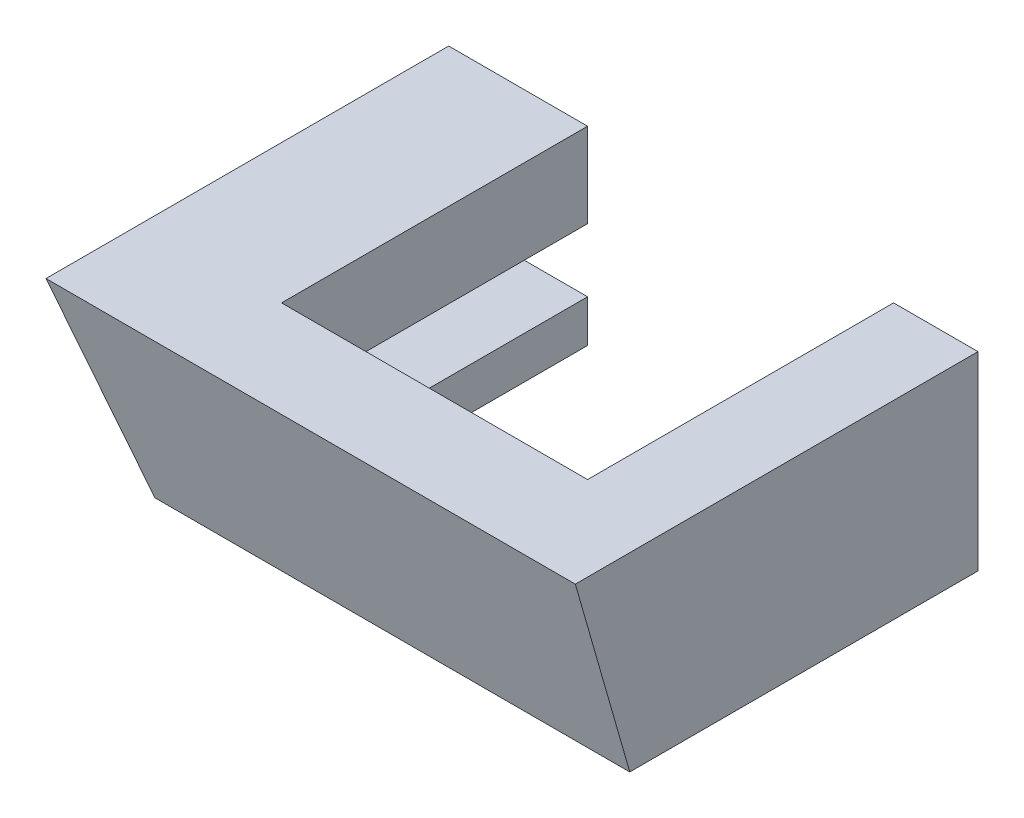
ISO-10303-21;
HEADER;
FILE_DESCRIPTION(('STEP AP214'),'2;1');
FILE_NAME('part.step','',(''),(''),'','','');
FILE_SCHEMA(('AUTOMOTIVE_DESIGN { 1 0 10303 214 1 1 1 1 }'));
ENDSEC;
DATA;
#1=APPLICATION_CONTEXT('core data for automotive mechanical design processes');
#2=APPLICATION_PROTOCOL_DEFINITION('international standard','automotive_design',2000,#1);
#3=PRODUCT_CONTEXT('',#1,'mechanical');
#4=PRODUCT('Part','Part','',(#3));
#5=PRODUCT_RELATED_PRODUCT_CATEGORY('part','',(#4));
#6=PRODUCT_DEFINITION_FORMATION('','',#4);
#7=PRODUCT_DEFINITION_CONTEXT('part definition',#1,'design');
#8=PRODUCT_DEFINITION('design','',#6,#7);
#9=PRODUCT_DEFINITION_SHAPE('','',#8);
#10=(LENGTH_UNIT() NAMED_UNIT(*) SI_UNIT(.MILLI.,.METRE.));
#11=(NAMED_UNIT(*) PLANE_ANGLE_UNIT() SI_UNIT($,.RADIAN.));
#12=(NAMED_UNIT(*) SI_UNIT($,.STERADIAN.) SOLID_ANGLE_UNIT());
#13=UNCERTAINTY_MEASURE_WITH_UNIT(LENGTH_MEASURE(1.E-05),#10,'distance_accuracy_value','');
#14=(GEOMETRIC_REPRESENTATION_CONTEXT(3) GLOBAL_UNCERTAINTY_ASSIGNED_CONTEXT((#13)) GLOBAL_UNIT_ASSIGNED_CONTEXT((#10,
#11,#12)) REPRESENTATION_CONTEXT('',''));
#15=CARTESIAN_POINT('',(0.,0.,0.));
#16=DIRECTION('',(0.,0.,1.));
#17=DIRECTION('',(1.,0.,0.));
#18=AXIS2_PLACEMENT_3D('',#15,#16,#17);
#19=CARTESIAN_POINT('',(-22.5892857142857,9.,40.6249999999999));
#20=DIRECTION('',(0.,0.,1.));
#21=DIRECTION('',(1.,0.,0.));
#22=AXIS2_PLACEMENT_3D('',#19,#20,#21);
#23=PLANE('',#22);
#24=DIRECTION('',(1.,0.,0.));
#25=VECTOR('',#24,1.);
#26=CARTESIAN_POINT('',(-23.5892857142856,2.,40.6249999999999));
#27=LINE('',#26,#25);
#28=CARTESIAN_POINT('',(-26.5892857142856,2.,40.6249999999999));
#29=VERTEX_POINT('',#28);
#30=CARTESIAN_POINT('',(-23.5892857142856,2.,40.6249999999999));
#31=VERTEX_POINT('',#30);
#32=EDGE_CURVE('E196',#29,#31,#27,.T.);
#33=ORIENTED_EDGE('',*,*,#32,.T.);
#34=DIRECTION('',(0.,1.,0.));
#35=VECTOR('',#34,1.);
#36=CARTESIAN_POINT('',(-23.5892857142856,2.,40.6249999999999));
#37=LINE('',#36,#35);
#38=CARTESIAN_POINT('',(-23.5892857142856,5.,40.6249999999999));
#39=VERTEX_POINT('',#38);
#40=EDGE_CURVE('E173',#31,#39,#37,.T.);
#41=ORIENTED_EDGE('',*,*,#40,.T.);
#42=DIRECTION('',(-1.,0.,0.));
#43=VECTOR('',#42,1.);
#44=CARTESIAN_POINT('',(-23.5892857142856,5.,40.6249999999999));
#45=LINE('',#44,#43);
#46=CARTESIAN_POINT('',(-26.5892857142856,5.,40.6249999999999));
#47=VERTEX_POINT('',#46);
#48=EDGE_CURVE('E167',#39,#47,#45,.T.);
#49=ORIENTED_EDGE('',*,*,#48,.T.);
#50=DIRECTION('',(0.,-1.,0.));
#51=VECTOR('',#50,1.);
#52=CARTESIAN_POINT('',(-26.5892857142857,9.,40.6249999999999));
#53=LINE('',#52,#51);
#54=CARTESIAN_POINT('',(-26.5892857142857,9.,40.6249999999999));
#55=VERTEX_POINT('',#54);
#56=EDGE_CURVE('E264',#55,#47,#53,.T.);
#57=ORIENTED_EDGE('',*,*,#56,.F.);
#58=DIRECTION('',(-1.,0.,0.));
#59=VECTOR('',#58,1.);
#60=CARTESIAN_POINT('',(-22.5892857142857,9.,40.6249999999999));
#61=LINE('',#60,#59);
#62=CARTESIAN_POINT('',(-22.5892857142857,9.,40.6249999999999));
#63=VERTEX_POINT('',#62);
#64=EDGE_CURVE('E283',#63,#55,#61,.T.);
#65=ORIENTED_EDGE('',*,*,#64,.F.);
#66=DIRECTION('',(0.,-1.,0.));
#67=VECTOR('',#66,1.);
#68=CARTESIAN_POINT('',(-22.5892857142857,9.,40.6249999999999));
#69=LINE('',#68,#67);
#70=CARTESIAN_POINT('',(-22.5892857142857,0.,40.6249999999999));
#71=VERTEX_POINT('',#70);
#72=EDGE_CURVE('E303',#63,#71,#69,.T.);
#73=ORIENTED_EDGE('',*,*,#72,.T.);
#74=DIRECTION('',(-1.,0.,0.));
#75=VECTOR('',#74,1.);
#76=CARTESIAN_POINT('',(-22.5892857142857,0.,40.6249999999999));
#77=LINE('',#76,#75);
#78=CARTESIAN_POINT('',(-26.5892857142857,0.,40.6249999999999));
#79=VERTEX_POINT('',#78);
#80=EDGE_CURVE('E298',#71,#79,#77,.T.);
#81=ORIENTED_EDGE('',*,*,#80,.T.);
#82=EDGE_CURVE('E268',#29,#79,#53,.T.);
#83=ORIENTED_EDGE('',*,*,#82,.F.);
#84=EDGE_LOOP('',(#33,#41,#49,#57,#65,#73,#81,#83));
#85=FACE_BOUND('',#84,.T.);
#86=ADVANCED_FACE('F45',(#85),#23,.F.);
#87=DIRECTION('',(1.,0.,0.));
#88=VECTOR('',#87,1.);
#89=CARTESIAN_POINT('',(-44.0892857142857,2.,40.6249999999999));
#90=LINE('',#89,#88);
#91=CARTESIAN_POINT('',(-44.0892857142857,2.,40.6249999999999));
#92=VERTEX_POINT('',#91);
#93=CARTESIAN_POINT('',(-41.0892857142856,2.,40.6249999999999));
#94=VERTEX_POINT('',#93);
#95=EDGE_CURVE('E218',#92,#94,#90,.T.);
#96=ORIENTED_EDGE('',*,*,#95,.T.);
#97=DIRECTION('',(0.,-1.,0.));
#98=VECTOR('',#97,1.);
#99=CARTESIAN_POINT('',(-41.0892857142857,9.,40.6249999999999));
#100=LINE('',#99,#98);
#101=CARTESIAN_POINT('',(-41.0892857142857,0.,40.6249999999999));
#102=VERTEX_POINT('',#101);
#103=EDGE_CURVE('E273',#94,#102,#100,.T.);
#104=ORIENTED_EDGE('',*,*,#103,.T.);
#105=CARTESIAN_POINT('',(-45.0892857142857,0.,40.6249999999999));
#106=VERTEX_POINT('',#105);
#107=EDGE_CURVE('E297',#102,#106,#77,.T.);
#108=ORIENTED_EDGE('',*,*,#107,.T.);
#109=DIRECTION('',(-0.275637355816999,0.961261695938319,0.));
#110=VECTOR('',#109,1.);
#111=CARTESIAN_POINT('',(-45.0892857142857,0.,40.6249999999999));
#112=LINE('',#111,#110);
#113=CARTESIAN_POINT('',(-47.6699941861149,9.,40.6249999999999));
#114=VERTEX_POINT('',#113);
#115=EDGE_CURVE('E287',#114,#106,#112,.F.);
#116=ORIENTED_EDGE('',*,*,#115,.F.);
#117=CARTESIAN_POINT('',(-41.0892857142857,9.,40.6249999999999));
#118=VERTEX_POINT('',#117);
#119=EDGE_CURVE('E281',#118,#114,#61,.T.);
#120=ORIENTED_EDGE('',*,*,#119,.F.);
#121=CARTESIAN_POINT('',(-41.0892857142856,5.,40.6249999999999));
#122=VERTEX_POINT('',#121);
#123=EDGE_CURVE('E269',#118,#122,#100,.T.);
#124=ORIENTED_EDGE('',*,*,#123,.T.);
#125=DIRECTION('',(-1.,0.,0.));
#126=VECTOR('',#125,1.);
#127=CARTESIAN_POINT('',(-44.0892857142857,5.,40.6249999999999));
#128=LINE('',#127,#126);
#129=CARTESIAN_POINT('',(-44.0892857142857,5.,40.6249999999999));
#130=VERTEX_POINT('',#129);
#131=EDGE_CURVE('E215',#122,#130,#128,.T.);
#132=ORIENTED_EDGE('',*,*,#131,.T.);
#133=DIRECTION('',(0.,-1.,0.));
#134=VECTOR('',#133,1.);
#135=CARTESIAN_POINT('',(-44.0892857142857,2.,40.6249999999999));
#136=LINE('',#135,#134);
#137=EDGE_CURVE('E209',#130,#92,#136,.T.);
#138=ORIENTED_EDGE('',*,*,#137,.T.);
#139=EDGE_LOOP('',(#96,#104,#108,#116,#120,#124,#132,#138));
#140=FACE_BOUND('',#139,.T.);
#141=ADVANCED_FACE('F339',(#140),#23,.F.);
#142=CARTESIAN_POINT('',(-26.5892857142857,9.,40.6249999999999));
#143=DIRECTION('',(1.,0.,0.));
#144=DIRECTION('',(0.,0.,-1.));
#145=AXIS2_PLACEMENT_3D('',#142,#143,#144);
#146=PLANE('',#145);
#147=DIRECTION('',(0.,0.,-1.));
#148=VECTOR('',#147,1.);
#149=CARTESIAN_POINT('',(-26.5892857142857,2.,59.3676406871192));
#150=LINE('',#149,#148);
#151=CARTESIAN_POINT('',(-26.5892857142857,2.,55.1249999999999));
#152=VERTEX_POINT('',#151);
#153=EDGE_CURVE('E62',#152,#29,#150,.T.);
#154=ORIENTED_EDGE('',*,*,#153,.T.);
#155=ORIENTED_EDGE('',*,*,#82,.T.);
#156=DIRECTION('',(0.,0.,1.));
#157=VECTOR('',#156,1.);
#158=CARTESIAN_POINT('',(-26.5892857142857,0.,40.6249999999999));
#159=LINE('',#158,#157);
#160=CARTESIAN_POINT('',(-26.5892857142857,0.,55.1249999999999));
#161=VERTEX_POINT('',#160);
#162=EDGE_CURVE('E245',#79,#161,#159,.T.);
#163=ORIENTED_EDGE('',*,*,#162,.T.);
#164=DIRECTION('',(0.,-1.,0.));
#165=VECTOR('',#164,1.);
#166=CARTESIAN_POINT('',(-26.5892857142857,9.,55.1249999999999));
#167=LINE('',#166,#165);
#168=EDGE_CURVE('E263',#152,#161,#167,.T.);
#169=ORIENTED_EDGE('',*,*,#168,.F.);
#170=EDGE_LOOP('',(#154,#155,#163,#169));
#171=FACE_BOUND('',#170,.T.);
#172=ADVANCED_FACE('F362',(#171),#146,.F.);
#173=DIRECTION('',(0.,0.,-1.));
#174=VECTOR('',#173,1.);
#175=CARTESIAN_POINT('',(-26.5892857142857,5.,59.3676406871192));
#176=LINE('',#175,#174);
#177=CARTESIAN_POINT('',(-26.5892857142857,5.,55.1249999999999));
#178=VERTEX_POINT('',#177);
#179=EDGE_CURVE('E201',#178,#47,#176,.T.);
#180=ORIENTED_EDGE('',*,*,#179,.F.);
#181=CARTESIAN_POINT('',(-26.5892857142857,9.,55.1249999999999));
#182=VERTEX_POINT('',#181);
#183=EDGE_CURVE('E181',#182,#178,#167,.T.);
#184=ORIENTED_EDGE('',*,*,#183,.F.);
#185=DIRECTION('',(0.,0.,1.));
#186=VECTOR('',#185,1.);
#187=CARTESIAN_POINT('',(-26.5892857142857,9.,40.6249999999999));
#188=LINE('',#187,#186);
#189=EDGE_CURVE('E249',#55,#182,#188,.T.);
#190=ORIENTED_EDGE('',*,*,#189,.F.);
#191=ORIENTED_EDGE('',*,*,#56,.T.);
#192=EDGE_LOOP('',(#180,#184,#190,#191));
#193=FACE_BOUND('',#192,.T.);
#194=ADVANCED_FACE('F332',(#193),#146,.F.);
#195=CARTESIAN_POINT('',(-41.0892857142857,9.,55.1249999999999));
#196=DIRECTION('',(-1.,0.,0.));
#197=DIRECTION('',(0.,0.,1.));
#198=AXIS2_PLACEMENT_3D('',#195,#196,#197);
#199=PLANE('',#198);
#200=DIRECTION('',(0.,0.,-1.));
#201=VECTOR('',#200,1.);
#202=CARTESIAN_POINT('',(-41.0892857142857,2.,59.3676406871192));
#203=LINE('',#202,#201);
#204=CARTESIAN_POINT('',(-41.0892857142857,2.,55.1249999999999));
#205=VERTEX_POINT('',#204);
#206=EDGE_CURVE('E214',#205,#94,#203,.T.);
#207=ORIENTED_EDGE('',*,*,#206,.F.);
#208=DIRECTION('',(0.,-1.,0.));
#209=VECTOR('',#208,1.);
#210=CARTESIAN_POINT('',(-41.0892857142857,9.,55.1249999999999));
#211=LINE('',#210,#209);
#212=CARTESIAN_POINT('',(-41.0892857142857,0.,55.1249999999999));
#213=VERTEX_POINT('',#212);
#214=EDGE_CURVE('E252',#205,#213,#211,.T.);
#215=ORIENTED_EDGE('',*,*,#214,.T.);
#216=DIRECTION('',(0.,0.,-1.));
#217=VECTOR('',#216,1.);
#218=CARTESIAN_POINT('',(-41.0892857142857,0.,55.1249999999999));
#219=LINE('',#218,#217);
#220=EDGE_CURVE('E192',#213,#102,#219,.T.);
#221=ORIENTED_EDGE('',*,*,#220,.T.);
#222=ORIENTED_EDGE('',*,*,#103,.F.);
#223=EDGE_LOOP('',(#207,#215,#221,#222));
#224=FACE_BOUND('',#223,.T.);
#225=ADVANCED_FACE('F359',(#224),#199,.F.);
#226=DIRECTION('',(0.,0.,-1.));
#227=VECTOR('',#226,1.);
#228=CARTESIAN_POINT('',(-41.0892857142857,5.,59.3676406871192));
#229=LINE('',#228,#227);
#230=CARTESIAN_POINT('',(-41.0892857142857,5.,55.1249999999999));
#231=VERTEX_POINT('',#230);
#232=EDGE_CURVE('E210',#231,#122,#229,.T.);
#233=ORIENTED_EDGE('',*,*,#232,.T.);
#234=ORIENTED_EDGE('',*,*,#123,.F.);
#235=DIRECTION('',(0.,0.,-1.));
#236=VECTOR('',#235,1.);
#237=CARTESIAN_POINT('',(-41.0892857142857,9.,55.1249999999999));
#238=LINE('',#237,#236);
#239=CARTESIAN_POINT('',(-41.0892857142857,9.,55.1249999999999));
#240=VERTEX_POINT('',#239);
#241=EDGE_CURVE('E244',#240,#118,#238,.T.);
#242=ORIENTED_EDGE('',*,*,#241,.F.);
#243=EDGE_CURVE('E274',#240,#231,#211,.T.);
#244=ORIENTED_EDGE('',*,*,#243,.T.);
#245=EDGE_LOOP('',(#233,#234,#242,#244));
#246=FACE_BOUND('',#245,.T.);
#247=ADVANCED_FACE('F335',(#246),#199,.F.);
#248=CARTESIAN_POINT('',(-45.0892857142857,0.,40.6249999999999));
#249=DIRECTION('',(-0.961261695938319,-0.275637355816999,0.));
#250=DIRECTION('',(0.275637355816999,-0.961261695938319,0.));
#251=AXIS2_PLACEMENT_3D('',#248,#249,#250);
#252=PLANE('',#251);
#253=DIRECTION('',(0.,0.,1.));
#254=VECTOR('',#253,1.);
#255=CARTESIAN_POINT('',(-45.0892857142857,0.,40.6249999999999));
#256=LINE('',#255,#254);
#257=CARTESIAN_POINT('',(-45.0892857142857,0.,57.1249999999999));
#258=VERTEX_POINT('',#257);
#259=EDGE_CURVE('E262',#106,#258,#256,.T.);
#260=ORIENTED_EDGE('',*,*,#259,.T.);
#261=DIRECTION('',(0.265727678029987,-0.926702542490083,-0.265727678029987));
#262=VECTOR('',#261,1.);
#263=CARTESIAN_POINT('',(-45.0892857142857,0.,57.1249999999999));
#264=LINE('',#263,#262);
#265=CARTESIAN_POINT('',(-47.6699941861149,9.,59.7057084718292));
#266=VERTEX_POINT('',#265);
#267=EDGE_CURVE('E11',#266,#258,#264,.T.);
#268=ORIENTED_EDGE('',*,*,#267,.F.);
#269=DIRECTION('',(0.,0.,-1.));
#270=VECTOR('',#269,1.);
#271=CARTESIAN_POINT('',(-47.6699941861149,9.,40.6249999999999));
#272=LINE('',#271,#270);
#273=EDGE_CURVE('E302',#114,#266,#272,.F.);
#274=ORIENTED_EDGE('',*,*,#273,.F.);
#275=ORIENTED_EDGE('',*,*,#115,.T.);
#276=EDGE_LOOP('',(#260,#268,#274,#275));
#277=FACE_BOUND('',#276,.T.);
#278=ADVANCED_FACE('F344',(#277),#252,.T.);
#279=CARTESIAN_POINT('',(-45.0892857142857,0.,57.1249999999999));
#280=DIRECTION('',(0.,-0.275637355816999,0.961261695938319));
#281=DIRECTION('',(0.,-0.961261695938319,-0.275637355816999));
#282=AXIS2_PLACEMENT_3D('',#279,#280,#281);
#283=PLANE('',#282);
#284=DIRECTION('',(1.,0.,0.));
#285=VECTOR('',#284,1.);
#286=CARTESIAN_POINT('',(-45.0892857142857,0.,57.1249999999999));
#287=LINE('',#286,#285);
#288=CARTESIAN_POINT('',(-22.5892857142857,0.,57.1249999999999));
#289=VERTEX_POINT('',#288);
#290=EDGE_CURVE('E291',#258,#289,#287,.T.);
#291=ORIENTED_EDGE('',*,*,#290,.T.);
#292=DIRECTION('',(0.,0.961261695938319,0.275637355816999));
#293=VECTOR('',#292,1.);
#294=CARTESIAN_POINT('',(-22.5892857142857,8.31621643270392,59.5096366890494));
#295=LINE('',#294,#293);
#296=CARTESIAN_POINT('',(-22.5892857142857,9.,59.7057084718292));
#297=VERTEX_POINT('',#296);
#298=EDGE_CURVE('E49',#297,#289,#295,.F.);
#299=ORIENTED_EDGE('',*,*,#298,.F.);
#300=DIRECTION('',(-1.,0.,0.));
#301=VECTOR('',#300,1.);
#302=CARTESIAN_POINT('',(-45.0892857142857,9.,59.7057084718292));
#303=LINE('',#302,#301);
#304=EDGE_CURVE('E282',#266,#297,#303,.F.);
#305=ORIENTED_EDGE('',*,*,#304,.F.);
#306=ORIENTED_EDGE('',*,*,#267,.T.);
#307=EDGE_LOOP('',(#291,#299,#305,#306));
#308=FACE_BOUND('',#307,.T.);
#309=ADVANCED_FACE('F47',(#308),#283,.T.);
#310=CARTESIAN_POINT('',(-22.5892857142857,9.,57.1249999999999));
#311=DIRECTION('',(-1.,0.,0.));
#312=DIRECTION('',(0.,0.,1.));
#313=AXIS2_PLACEMENT_3D('',#310,#311,#312);
#314=PLANE('',#313);
#315=DIRECTION('',(0.,0.,-1.));
#316=VECTOR('',#315,1.);
#317=CARTESIAN_POINT('',(-22.5892857142857,0.,57.1249999999999));
#318=LINE('',#317,#316);
#319=EDGE_CURVE('E294',#289,#71,#318,.T.);
#320=ORIENTED_EDGE('',*,*,#319,.T.);
#321=ORIENTED_EDGE('',*,*,#72,.F.);
#322=DIRECTION('',(0.,0.,-1.));
#323=VECTOR('',#322,1.);
#324=CARTESIAN_POINT('',(-22.5892857142857,9.,57.1249999999999));
#325=LINE('',#324,#323);
#326=EDGE_CURVE('E278',#297,#63,#325,.T.);
#327=ORIENTED_EDGE('',*,*,#326,.F.);
#328=ORIENTED_EDGE('',*,*,#298,.T.);
#329=EDGE_LOOP('',(#320,#321,#327,#328));
#330=FACE_BOUND('',#329,.T.);
#331=ADVANCED_FACE('F325',(#330),#314,.F.);
#332=CARTESIAN_POINT('',(0.,9.,0.));
#333=DIRECTION('',(0.,1.,0.));
#334=DIRECTION('',(0.,0.,1.));
#335=AXIS2_PLACEMENT_3D('',#332,#333,#334);
#336=PLANE('',#335);
#337=ORIENTED_EDGE('',*,*,#189,.T.);
#338=DIRECTION('',(-1.,0.,0.));
#339=VECTOR('',#338,1.);
#340=CARTESIAN_POINT('',(-26.5892857142857,9.,55.1249999999999));
#341=LINE('',#340,#339);
#342=EDGE_CURVE('E240',#182,#240,#341,.T.);
#343=ORIENTED_EDGE('',*,*,#342,.T.);
#344=ORIENTED_EDGE('',*,*,#241,.T.);
#345=ORIENTED_EDGE('',*,*,#119,.T.);
#346=ORIENTED_EDGE('',*,*,#273,.T.);
#347=ORIENTED_EDGE('',*,*,#304,.T.);
#348=ORIENTED_EDGE('',*,*,#326,.T.);
#349=ORIENTED_EDGE('',*,*,#64,.T.);
#350=EDGE_LOOP('',(#337,#343,#344,#345,#346,#347,#348,#349));
#351=FACE_BOUND('',#350,.T.);
#352=ADVANCED_FACE('F315',(#351),#336,.T.);
#353=CARTESIAN_POINT('',(0.,0.,0.));
#354=DIRECTION('',(0.,1.,0.));
#355=DIRECTION('',(0.,0.,1.));
#356=AXIS2_PLACEMENT_3D('',#353,#354,#355);
#357=PLANE('',#356);
#358=DIRECTION('',(-1.,0.,0.));
#359=VECTOR('',#358,1.);
#360=CARTESIAN_POINT('',(-26.5892857142857,0.,55.1249999999999));
#361=LINE('',#360,#359);
#362=EDGE_CURVE('E188',#161,#213,#361,.T.);
#363=ORIENTED_EDGE('',*,*,#362,.F.);
#364=ORIENTED_EDGE('',*,*,#162,.F.);
#365=ORIENTED_EDGE('',*,*,#80,.F.);
#366=ORIENTED_EDGE('',*,*,#319,.F.);
#367=ORIENTED_EDGE('',*,*,#290,.F.);
#368=ORIENTED_EDGE('',*,*,#259,.F.);
#369=ORIENTED_EDGE('',*,*,#107,.F.);
#370=ORIENTED_EDGE('',*,*,#220,.F.);
#371=EDGE_LOOP('',(#363,#364,#365,#366,#367,#368,#369,#370));
#372=FACE_BOUND('',#371,.T.);
#373=ADVANCED_FACE('F347',(#372),#357,.F.);
#374=CARTESIAN_POINT('',(-26.5892857142857,9.,55.1249999999999));
#375=DIRECTION('',(0.,0.,1.));
#376=DIRECTION('',(1.,0.,0.));
#377=AXIS2_PLACEMENT_3D('',#374,#375,#376);
#378=PLANE('',#377);
#379=ORIENTED_EDGE('',*,*,#362,.T.);
#380=ORIENTED_EDGE('',*,*,#214,.F.);
#381=DIRECTION('',(1.,0.,0.));
#382=VECTOR('',#381,1.);
#383=CARTESIAN_POINT('',(-44.0892857142857,2.,55.1249999999999));
#384=LINE('',#383,#382);
#385=CARTESIAN_POINT('',(-44.0892857142857,2.,55.1249999999999));
#386=VERTEX_POINT('',#385);
#387=EDGE_CURVE('E228',#386,#205,#384,.T.);
#388=ORIENTED_EDGE('',*,*,#387,.F.);
#389=DIRECTION('',(0.,-1.,0.));
#390=VECTOR('',#389,1.);
#391=CARTESIAN_POINT('',(-44.0892857142857,2.,55.1249999999999));
#392=LINE('',#391,#390);
#393=CARTESIAN_POINT('',(-44.0892857142857,5.,55.1249999999999));
#394=VERTEX_POINT('',#393);
#395=EDGE_CURVE('E224',#394,#386,#392,.T.);
#396=ORIENTED_EDGE('',*,*,#395,.F.);
#397=DIRECTION('',(-1.,0.,0.));
#398=VECTOR('',#397,1.);
#399=CARTESIAN_POINT('',(-44.0892857142857,5.,55.1249999999999));
#400=LINE('',#399,#398);
#401=EDGE_CURVE('E70',#231,#394,#400,.T.);
#402=ORIENTED_EDGE('',*,*,#401,.F.);
#403=ORIENTED_EDGE('',*,*,#243,.F.);
#404=ORIENTED_EDGE('',*,*,#342,.F.);
#405=ORIENTED_EDGE('',*,*,#183,.T.);
#406=DIRECTION('',(-1.,0.,0.));
#407=VECTOR('',#406,1.);
#408=CARTESIAN_POINT('',(-23.5892857142857,5.,55.1249999999999));
#409=LINE('',#408,#407);
#410=CARTESIAN_POINT('',(-23.5892857142857,5.,55.1249999999999));
#411=VERTEX_POINT('',#410);
#412=EDGE_CURVE('E164',#411,#178,#409,.T.);
#413=ORIENTED_EDGE('',*,*,#412,.F.);
#414=DIRECTION('',(0.,1.,0.));
#415=VECTOR('',#414,1.);
#416=CARTESIAN_POINT('',(-23.5892857142857,2.,55.1249999999999));
#417=LINE('',#416,#415);
#418=CARTESIAN_POINT('',(-23.5892857142857,2.,55.1249999999999));
#419=VERTEX_POINT('',#418);
#420=EDGE_CURVE('E178',#419,#411,#417,.T.);
#421=ORIENTED_EDGE('',*,*,#420,.F.);
#422=DIRECTION('',(1.,0.,0.));
#423=VECTOR('',#422,1.);
#424=CARTESIAN_POINT('',(-23.5892857142857,2.,55.1249999999999));
#425=LINE('',#424,#423);
#426=EDGE_CURVE('E183',#152,#419,#425,.T.);
#427=ORIENTED_EDGE('',*,*,#426,.F.);
#428=ORIENTED_EDGE('',*,*,#168,.T.);
#429=EDGE_LOOP('',(#379,#380,#388,#396,#402,#403,#404,#405,#413,#421,#427,#428));
#430=FACE_BOUND('',#429,.T.);
#431=ADVANCED_FACE('F177',(#430),#378,.F.);
#432=CARTESIAN_POINT('',(-44.0892857142857,2.,59.3676406871192));
#433=DIRECTION('',(1.,0.,0.));
#434=DIRECTION('',(0.,0.,-1.));
#435=AXIS2_PLACEMENT_3D('',#432,#433,#434);
#436=PLANE('',#435);
#437=ORIENTED_EDGE('',*,*,#395,.T.);
#438=DIRECTION('',(0.,0.,-1.));
#439=VECTOR('',#438,1.);
#440=CARTESIAN_POINT('',(-44.0892857142857,2.,59.3676406871192));
#441=LINE('',#440,#439);
#442=EDGE_CURVE('E219',#386,#92,#441,.T.);
#443=ORIENTED_EDGE('',*,*,#442,.T.);
#444=ORIENTED_EDGE('',*,*,#137,.F.);
#445=DIRECTION('',(0.,0.,-1.));
#446=VECTOR('',#445,1.);
#447=CARTESIAN_POINT('',(-44.0892857142857,5.,59.3676406871192));
#448=LINE('',#447,#446);
#449=EDGE_CURVE('E206',#394,#130,#448,.T.);
#450=ORIENTED_EDGE('',*,*,#449,.F.);
#451=EDGE_LOOP('',(#437,#443,#444,#450));
#452=FACE_BOUND('',#451,.T.);
#453=ADVANCED_FACE('F389',(#452),#436,.T.);
#454=CARTESIAN_POINT('',(-44.0892857142857,2.,59.3676406871192));
#455=DIRECTION('',(0.,1.,0.));
#456=DIRECTION('',(0.,0.,1.));
#457=AXIS2_PLACEMENT_3D('',#454,#455,#456);
#458=PLANE('',#457);
#459=ORIENTED_EDGE('',*,*,#387,.T.);
#460=ORIENTED_EDGE('',*,*,#206,.T.);
#461=ORIENTED_EDGE('',*,*,#95,.F.);
#462=ORIENTED_EDGE('',*,*,#442,.F.);
#463=EDGE_LOOP('',(#459,#460,#461,#462));
#464=FACE_BOUND('',#463,.T.);
#465=ADVANCED_FACE('F406',(#464),#458,.T.);
#466=CARTESIAN_POINT('',(-44.0892857142857,5.,59.3676406871192));
#467=DIRECTION('',(0.,-1.,0.));
#468=DIRECTION('',(0.,0.,-1.));
#469=AXIS2_PLACEMENT_3D('',#466,#467,#468);
#470=PLANE('',#469);
#471=ORIENTED_EDGE('',*,*,#401,.T.);
#472=ORIENTED_EDGE('',*,*,#449,.T.);
#473=ORIENTED_EDGE('',*,*,#131,.F.);
#474=ORIENTED_EDGE('',*,*,#232,.F.);
#475=EDGE_LOOP('',(#471,#472,#473,#474));
#476=FACE_BOUND('',#475,.T.);
#477=ADVANCED_FACE('F414',(#476),#470,.T.);
#478=CARTESIAN_POINT('',(-23.5892857142857,2.,59.3676406871192));
#479=DIRECTION('',(0.,1.,0.));
#480=DIRECTION('',(0.,0.,1.));
#481=AXIS2_PLACEMENT_3D('',#478,#479,#480);
#482=PLANE('',#481);
#483=ORIENTED_EDGE('',*,*,#426,.T.);
#484=DIRECTION('',(0.,0.,-1.));
#485=VECTOR('',#484,1.);
#486=CARTESIAN_POINT('',(-23.5892857142857,2.,59.3676406871192));
#487=LINE('',#486,#485);
#488=EDGE_CURVE('E186',#419,#31,#487,.T.);
#489=ORIENTED_EDGE('',*,*,#488,.T.);
#490=ORIENTED_EDGE('',*,*,#32,.F.);
#491=ORIENTED_EDGE('',*,*,#153,.F.);
#492=EDGE_LOOP('',(#483,#489,#490,#491));
#493=FACE_BOUND('',#492,.T.);
#494=ADVANCED_FACE('F422',(#493),#482,.T.);
#495=CARTESIAN_POINT('',(-23.5892857142857,2.,59.3676406871192));
#496=DIRECTION('',(-1.,0.,0.));
#497=DIRECTION('',(0.,0.,1.));
#498=AXIS2_PLACEMENT_3D('',#495,#496,#497);
#499=PLANE('',#498);
#500=ORIENTED_EDGE('',*,*,#420,.T.);
#501=DIRECTION('',(0.,0.,-1.));
#502=VECTOR('',#501,1.);
#503=CARTESIAN_POINT('',(-23.5892857142857,5.,59.3676406871192));
#504=LINE('',#503,#502);
#505=EDGE_CURVE('E161',#411,#39,#504,.T.);
#506=ORIENTED_EDGE('',*,*,#505,.T.);
#507=ORIENTED_EDGE('',*,*,#40,.F.);
#508=ORIENTED_EDGE('',*,*,#488,.F.);
#509=EDGE_LOOP('',(#500,#506,#507,#508));
#510=FACE_BOUND('',#509,.T.);
#511=ADVANCED_FACE('F185',(#510),#499,.T.);
#512=CARTESIAN_POINT('',(-23.5892857142857,5.,59.3676406871192));
#513=DIRECTION('',(0.,-1.,0.));
#514=DIRECTION('',(0.,0.,-1.));
#515=AXIS2_PLACEMENT_3D('',#512,#513,#514);
#516=PLANE('',#515);
#517=ORIENTED_EDGE('',*,*,#412,.T.);
#518=ORIENTED_EDGE('',*,*,#179,.T.);
#519=ORIENTED_EDGE('',*,*,#48,.F.);
#520=ORIENTED_EDGE('',*,*,#505,.F.);
#521=EDGE_LOOP('',(#517,#518,#519,#520));
#522=FACE_BOUND('',#521,.T.);
#523=ADVANCED_FACE('F163',(#522),#516,.T.);
#524=CLOSED_SHELL('',(#86,#141,#172,#194,#225,#247,#278,#309,#331,#352,#373,#431,#453,#465,#477,
#494,#511,#523));
#525=MANIFOLD_SOLID_BREP('B2',#524);
#526=ADVANCED_BREP_SHAPE_REPRESENTATION('',(#18,#525),#14);
#527=SHAPE_DEFINITION_REPRESENTATION(#9,#526);
ENDSEC;
END-ISO-10303-21;
